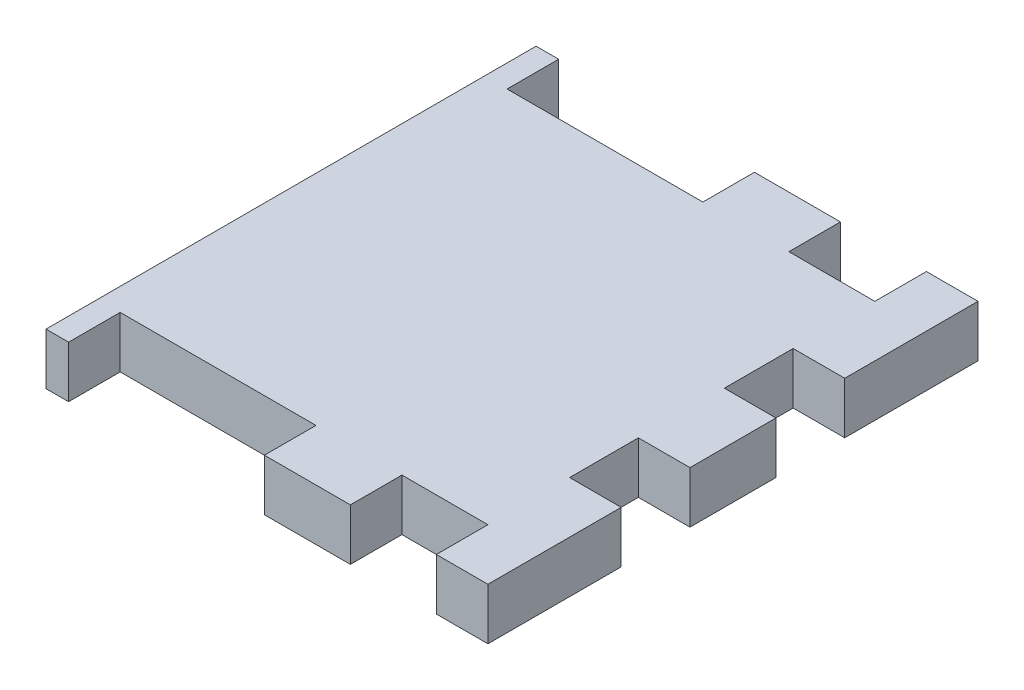
ISO-10303-21;
HEADER;
FILE_DESCRIPTION(('STEP AP214'),'2;1');
FILE_NAME('part.step','',(''),(''),'','','');
FILE_SCHEMA(('AUTOMOTIVE_DESIGN { 1 0 10303 214 1 1 1 1 }'));
ENDSEC;
DATA;
#1=APPLICATION_CONTEXT('core data for automotive mechanical design processes');
#2=APPLICATION_PROTOCOL_DEFINITION('international standard','automotive_design',2000,#1);
#3=PRODUCT_CONTEXT('',#1,'mechanical');
#4=PRODUCT('Part','Part','',(#3));
#5=PRODUCT_RELATED_PRODUCT_CATEGORY('part','',(#4));
#6=PRODUCT_DEFINITION_FORMATION('','',#4);
#7=PRODUCT_DEFINITION_CONTEXT('part definition',#1,'design');
#8=PRODUCT_DEFINITION('design','',#6,#7);
#9=PRODUCT_DEFINITION_SHAPE('','',#8);
#10=(LENGTH_UNIT() NAMED_UNIT(*) SI_UNIT(.MILLI.,.METRE.));
#11=(NAMED_UNIT(*) PLANE_ANGLE_UNIT() SI_UNIT($,.RADIAN.));
#12=(NAMED_UNIT(*) SI_UNIT($,.STERADIAN.) SOLID_ANGLE_UNIT());
#13=UNCERTAINTY_MEASURE_WITH_UNIT(LENGTH_MEASURE(1.E-05),#10,'distance_accuracy_value','');
#14=(GEOMETRIC_REPRESENTATION_CONTEXT(3) GLOBAL_UNCERTAINTY_ASSIGNED_CONTEXT((#13)) GLOBAL_UNIT_ASSIGNED_CONTEXT((#10,
#11,#12)) REPRESENTATION_CONTEXT('',''));
#15=CARTESIAN_POINT('',(0.,0.,0.));
#16=DIRECTION('',(0.,0.,1.));
#17=DIRECTION('',(1.,0.,0.));
#18=AXIS2_PLACEMENT_3D('',#15,#16,#17);
#19=CARTESIAN_POINT('',(12.85,3.,-14.25));
#20=DIRECTION('',(-1.,0.,0.));
#21=DIRECTION('',(0.,0.,1.));
#22=AXIS2_PLACEMENT_3D('',#19,#20,#21);
#23=PLANE('',#22);
#24=DIRECTION('',(0.,0.,-1.));
#25=VECTOR('',#24,1.);
#26=CARTESIAN_POINT('',(12.85,3.,-14.25));
#27=LINE('',#26,#25);
#28=CARTESIAN_POINT('',(12.85,3.,2.50000000000009));
#29=VERTEX_POINT('',#28);
#30=CARTESIAN_POINT('',(12.85,3.,-2.49999999999991));
#31=VERTEX_POINT('',#30);
#32=EDGE_CURVE('E376',#29,#31,#27,.T.);
#33=ORIENTED_EDGE('',*,*,#32,.F.);
#34=DIRECTION('',(0.,-1.,0.));
#35=VECTOR('',#34,1.);
#36=CARTESIAN_POINT('',(12.85,10.,2.50000000000009));
#37=LINE('',#36,#35);
#38=CARTESIAN_POINT('',(12.85,0.,2.50000000000009));
#39=VERTEX_POINT('',#38);
#40=EDGE_CURVE('E247',#29,#39,#37,.T.);
#41=ORIENTED_EDGE('',*,*,#40,.T.);
#42=DIRECTION('',(0.,0.,-1.));
#43=VECTOR('',#42,1.);
#44=CARTESIAN_POINT('',(12.85,0.,-14.25));
#45=LINE('',#44,#43);
#46=CARTESIAN_POINT('',(12.85,0.,-2.4999999999999));
#47=VERTEX_POINT('',#46);
#48=EDGE_CURVE('E394',#39,#47,#45,.T.);
#49=ORIENTED_EDGE('',*,*,#48,.T.);
#50=DIRECTION('',(0.,-1.,0.));
#51=VECTOR('',#50,1.);
#52=CARTESIAN_POINT('',(12.85,10.,-2.49999999999991));
#53=LINE('',#52,#51);
#54=EDGE_CURVE('E276',#31,#47,#53,.T.);
#55=ORIENTED_EDGE('',*,*,#54,.F.);
#56=EDGE_LOOP('',(#33,#41,#49,#55));
#57=FACE_BOUND('',#56,.T.);
#58=ADVANCED_FACE('F34',(#57),#23,.F.);
#59=CARTESIAN_POINT('',(12.85,3.,-6.49999999999989));
#60=VERTEX_POINT('',#59);
#61=CARTESIAN_POINT('',(12.85,3.,-14.25));
#62=VERTEX_POINT('',#61);
#63=EDGE_CURVE('E377',#60,#62,#27,.T.);
#64=ORIENTED_EDGE('',*,*,#63,.F.);
#65=DIRECTION('',(0.,-1.,0.));
#66=VECTOR('',#65,1.);
#67=CARTESIAN_POINT('',(12.85,10.,-6.49999999999989));
#68=LINE('',#67,#66);
#69=CARTESIAN_POINT('',(12.85,0.,-6.49999999999989));
#70=VERTEX_POINT('',#69);
#71=EDGE_CURVE('E258',#60,#70,#68,.T.);
#72=ORIENTED_EDGE('',*,*,#71,.T.);
#73=CARTESIAN_POINT('',(12.85,0.,-14.25));
#74=VERTEX_POINT('',#73);
#75=EDGE_CURVE('E371',#70,#74,#45,.T.);
#76=ORIENTED_EDGE('',*,*,#75,.T.);
#77=DIRECTION('',(0.,-1.,0.));
#78=VECTOR('',#77,1.);
#79=CARTESIAN_POINT('',(12.85,3.,-14.25));
#80=LINE('',#79,#78);
#81=EDGE_CURVE('E11',#62,#74,#80,.T.);
#82=ORIENTED_EDGE('',*,*,#81,.F.);
#83=EDGE_LOOP('',(#64,#72,#76,#82));
#84=FACE_BOUND('',#83,.T.);
#85=ADVANCED_FACE('F460',(#84),#23,.F.);
#86=CARTESIAN_POINT('',(-12.85,3.,-14.25));
#87=DIRECTION('',(0.,0.,1.));
#88=DIRECTION('',(1.,0.,0.));
#89=AXIS2_PLACEMENT_3D('',#86,#87,#88);
#90=PLANE('',#89);
#91=DIRECTION('',(-1.,0.,0.));
#92=VECTOR('',#91,1.);
#93=CARTESIAN_POINT('',(-12.85,3.,-14.25));
#94=LINE('',#93,#92);
#95=CARTESIAN_POINT('',(-11.5362094533038,3.,-14.25));
#96=VERTEX_POINT('',#95);
#97=CARTESIAN_POINT('',(-12.85,3.,-14.25));
#98=VERTEX_POINT('',#97);
#99=EDGE_CURVE('E375',#96,#98,#94,.T.);
#100=ORIENTED_EDGE('',*,*,#99,.F.);
#101=DIRECTION('',(0.,-1.,0.));
#102=VECTOR('',#101,1.);
#103=CARTESIAN_POINT('',(-11.5362094533038,10.,-14.25));
#104=LINE('',#103,#102);
#105=CARTESIAN_POINT('',(-11.5362094533038,0.,-14.25));
#106=VERTEX_POINT('',#105);
#107=EDGE_CURVE('E287',#96,#106,#104,.T.);
#108=ORIENTED_EDGE('',*,*,#107,.T.);
#109=DIRECTION('',(-1.,0.,0.));
#110=VECTOR('',#109,1.);
#111=CARTESIAN_POINT('',(-12.85,0.,-14.25));
#112=LINE('',#111,#110);
#113=CARTESIAN_POINT('',(-12.85,0.,-14.25));
#114=VERTEX_POINT('',#113);
#115=EDGE_CURVE('E393',#106,#114,#112,.T.);
#116=ORIENTED_EDGE('',*,*,#115,.T.);
#117=DIRECTION('',(0.,-1.,0.));
#118=VECTOR('',#117,1.);
#119=CARTESIAN_POINT('',(-12.85,3.,-14.25));
#120=LINE('',#119,#118);
#121=EDGE_CURVE('E42',#98,#114,#120,.T.);
#122=ORIENTED_EDGE('',*,*,#121,.F.);
#123=EDGE_LOOP('',(#100,#108,#116,#122));
#124=FACE_BOUND('',#123,.T.);
#125=ADVANCED_FACE('F437',(#124),#90,.F.);
#126=CARTESIAN_POINT('',(9.85,0.,-14.25));
#127=VERTEX_POINT('',#126);
#128=EDGE_CURVE('E395',#74,#127,#112,.T.);
#129=ORIENTED_EDGE('',*,*,#128,.T.);
#130=DIRECTION('',(0.,-1.,0.));
#131=VECTOR('',#130,1.);
#132=CARTESIAN_POINT('',(9.85,10.,-14.25));
#133=LINE('',#132,#131);
#134=CARTESIAN_POINT('',(9.85,3.,-14.25));
#135=VERTEX_POINT('',#134);
#136=EDGE_CURVE('E328',#135,#127,#133,.T.);
#137=ORIENTED_EDGE('',*,*,#136,.F.);
#138=EDGE_CURVE('E378',#62,#135,#94,.T.);
#139=ORIENTED_EDGE('',*,*,#138,.F.);
#140=ORIENTED_EDGE('',*,*,#81,.T.);
#141=EDGE_LOOP('',(#129,#137,#139,#140));
#142=FACE_BOUND('',#141,.T.);
#143=ADVANCED_FACE('F474',(#142),#90,.F.);
#144=CARTESIAN_POINT('',(-12.85,3.,14.25));
#145=DIRECTION('',(0.,0.,-1.));
#146=DIRECTION('',(-1.,0.,0.));
#147=AXIS2_PLACEMENT_3D('',#144,#145,#146);
#148=PLANE('',#147);
#149=DIRECTION('',(1.,0.,0.));
#150=VECTOR('',#149,1.);
#151=CARTESIAN_POINT('',(-12.85,3.,14.25));
#152=LINE('',#151,#150);
#153=CARTESIAN_POINT('',(9.85,3.,14.2500000000002));
#154=VERTEX_POINT('',#153);
#155=CARTESIAN_POINT('',(12.85,3.,14.25));
#156=VERTEX_POINT('',#155);
#157=EDGE_CURVE('E384',#154,#156,#152,.T.);
#158=ORIENTED_EDGE('',*,*,#157,.F.);
#159=DIRECTION('',(0.,-1.,0.));
#160=VECTOR('',#159,1.);
#161=CARTESIAN_POINT('',(9.85,10.,14.2500000000002));
#162=LINE('',#161,#160);
#163=CARTESIAN_POINT('',(9.85,0.,14.2500000000002));
#164=VERTEX_POINT('',#163);
#165=EDGE_CURVE('E293',#154,#164,#162,.T.);
#166=ORIENTED_EDGE('',*,*,#165,.T.);
#167=DIRECTION('',(1.,0.,0.));
#168=VECTOR('',#167,1.);
#169=CARTESIAN_POINT('',(-12.85,0.,14.25));
#170=LINE('',#169,#168);
#171=CARTESIAN_POINT('',(12.85,0.,14.25));
#172=VERTEX_POINT('',#171);
#173=EDGE_CURVE('E401',#164,#172,#170,.T.);
#174=ORIENTED_EDGE('',*,*,#173,.T.);
#175=DIRECTION('',(0.,-1.,0.));
#176=VECTOR('',#175,1.);
#177=CARTESIAN_POINT('',(12.85,3.,14.25));
#178=LINE('',#177,#176);
#179=EDGE_CURVE('E388',#156,#172,#178,.T.);
#180=ORIENTED_EDGE('',*,*,#179,.F.);
#181=EDGE_LOOP('',(#158,#166,#174,#180));
#182=FACE_BOUND('',#181,.T.);
#183=ADVANCED_FACE('F475',(#182),#148,.F.);
#184=CARTESIAN_POINT('',(-0.150000000000003,0.,14.2500000000002));
#185=VERTEX_POINT('',#184);
#186=CARTESIAN_POINT('',(4.84999999999999,0.,14.25));
#187=VERTEX_POINT('',#186);
#188=EDGE_CURVE('E404',#185,#187,#170,.T.);
#189=ORIENTED_EDGE('',*,*,#188,.T.);
#190=DIRECTION('',(0.,-1.,0.));
#191=VECTOR('',#190,1.);
#192=CARTESIAN_POINT('',(4.85,10.,14.2500000000002));
#193=LINE('',#192,#191);
#194=CARTESIAN_POINT('',(4.85,3.,14.2500000000002));
#195=VERTEX_POINT('',#194);
#196=EDGE_CURVE('E299',#195,#187,#193,.T.);
#197=ORIENTED_EDGE('',*,*,#196,.F.);
#198=CARTESIAN_POINT('',(-0.150000000000003,3.,14.2500000000002));
#199=VERTEX_POINT('',#198);
#200=EDGE_CURVE('E389',#199,#195,#152,.T.);
#201=ORIENTED_EDGE('',*,*,#200,.F.);
#202=DIRECTION('',(0.,-1.,0.));
#203=VECTOR('',#202,1.);
#204=CARTESIAN_POINT('',(-0.150000000000003,10.,14.2500000000002));
#205=LINE('',#204,#203);
#206=EDGE_CURVE('E233',#199,#185,#205,.T.);
#207=ORIENTED_EDGE('',*,*,#206,.T.);
#208=EDGE_LOOP('',(#189,#197,#201,#207));
#209=FACE_BOUND('',#208,.T.);
#210=ADVANCED_FACE('F468',(#209),#148,.F.);
#211=CARTESIAN_POINT('',(12.85,0.,6.50000000000006));
#212=VERTEX_POINT('',#211);
#213=EDGE_CURVE('E390',#172,#212,#45,.T.);
#214=ORIENTED_EDGE('',*,*,#213,.T.);
#215=DIRECTION('',(0.,-1.,0.));
#216=VECTOR('',#215,1.);
#217=CARTESIAN_POINT('',(12.85,10.,6.50000000000007));
#218=LINE('',#217,#216);
#219=CARTESIAN_POINT('',(12.85,3.,6.50000000000007));
#220=VERTEX_POINT('',#219);
#221=EDGE_CURVE('E262',#220,#212,#218,.T.);
#222=ORIENTED_EDGE('',*,*,#221,.F.);
#223=EDGE_CURVE('E372',#156,#220,#27,.T.);
#224=ORIENTED_EDGE('',*,*,#223,.F.);
#225=ORIENTED_EDGE('',*,*,#179,.T.);
#226=EDGE_LOOP('',(#214,#222,#224,#225));
#227=FACE_BOUND('',#226,.T.);
#228=ADVANCED_FACE('F36',(#227),#23,.F.);
#229=CARTESIAN_POINT('',(4.85,0.,-14.25));
#230=VERTEX_POINT('',#229);
#231=CARTESIAN_POINT('',(-0.150000000000003,0.,-14.25));
#232=VERTEX_POINT('',#231);
#233=EDGE_CURVE('E399',#230,#232,#112,.T.);
#234=ORIENTED_EDGE('',*,*,#233,.T.);
#235=DIRECTION('',(0.,-1.,0.));
#236=VECTOR('',#235,1.);
#237=CARTESIAN_POINT('',(-0.149999999999999,10.,-14.2500000000001));
#238=LINE('',#237,#236);
#239=CARTESIAN_POINT('',(-0.149999999999999,3.,-14.2500000000001));
#240=VERTEX_POINT('',#239);
#241=EDGE_CURVE('E57',#240,#232,#238,.T.);
#242=ORIENTED_EDGE('',*,*,#241,.F.);
#243=CARTESIAN_POINT('',(4.85,3.,-14.25));
#244=VERTEX_POINT('',#243);
#245=EDGE_CURVE('E382',#244,#240,#94,.T.);
#246=ORIENTED_EDGE('',*,*,#245,.F.);
#247=DIRECTION('',(0.,-1.,0.));
#248=VECTOR('',#247,1.);
#249=CARTESIAN_POINT('',(4.85,10.,-14.25));
#250=LINE('',#249,#248);
#251=EDGE_CURVE('E331',#244,#230,#250,.T.);
#252=ORIENTED_EDGE('',*,*,#251,.T.);
#253=EDGE_LOOP('',(#234,#242,#246,#252));
#254=FACE_BOUND('',#253,.T.);
#255=ADVANCED_FACE('F434',(#254),#90,.F.);
#256=CARTESIAN_POINT('',(-12.85,3.,-14.25));
#257=DIRECTION('',(1.,0.,0.));
#258=DIRECTION('',(0.,0.,-1.));
#259=AXIS2_PLACEMENT_3D('',#256,#257,#258);
#260=PLANE('',#259);
#261=DIRECTION('',(0.,0.,1.));
#262=VECTOR('',#261,1.);
#263=CARTESIAN_POINT('',(-12.85,0.,-14.25));
#264=LINE('',#263,#262);
#265=CARTESIAN_POINT('',(-12.85,0.,14.25));
#266=VERTEX_POINT('',#265);
#267=EDGE_CURVE('E398',#114,#266,#264,.T.);
#268=ORIENTED_EDGE('',*,*,#267,.T.);
#269=DIRECTION('',(0.,-1.,0.));
#270=VECTOR('',#269,1.);
#271=CARTESIAN_POINT('',(-12.85,3.,14.25));
#272=LINE('',#271,#270);
#273=CARTESIAN_POINT('',(-12.85,3.,14.25));
#274=VERTEX_POINT('',#273);
#275=EDGE_CURVE('E407',#274,#266,#272,.T.);
#276=ORIENTED_EDGE('',*,*,#275,.F.);
#277=DIRECTION('',(0.,0.,1.));
#278=VECTOR('',#277,1.);
#279=CARTESIAN_POINT('',(-12.85,3.,-14.25));
#280=LINE('',#279,#278);
#281=EDGE_CURVE('E381',#98,#274,#280,.T.);
#282=ORIENTED_EDGE('',*,*,#281,.F.);
#283=ORIENTED_EDGE('',*,*,#121,.T.);
#284=EDGE_LOOP('',(#268,#276,#282,#283));
#285=FACE_BOUND('',#284,.T.);
#286=ADVANCED_FACE('F414',(#285),#260,.F.);
#287=CARTESIAN_POINT('',(-11.5362094533038,0.,14.25));
#288=VERTEX_POINT('',#287);
#289=EDGE_CURVE('E402',#266,#288,#170,.T.);
#290=ORIENTED_EDGE('',*,*,#289,.T.);
#291=DIRECTION('',(0.,-1.,0.));
#292=VECTOR('',#291,1.);
#293=CARTESIAN_POINT('',(-11.5362094533038,10.,14.25));
#294=LINE('',#293,#292);
#295=CARTESIAN_POINT('',(-11.5362094533038,3.,14.25));
#296=VERTEX_POINT('',#295);
#297=EDGE_CURVE('E243',#296,#288,#294,.T.);
#298=ORIENTED_EDGE('',*,*,#297,.F.);
#299=EDGE_CURVE('E385',#274,#296,#152,.T.);
#300=ORIENTED_EDGE('',*,*,#299,.F.);
#301=ORIENTED_EDGE('',*,*,#275,.T.);
#302=EDGE_LOOP('',(#290,#298,#300,#301));
#303=FACE_BOUND('',#302,.T.);
#304=ADVANCED_FACE('F421',(#303),#148,.F.);
#305=CARTESIAN_POINT('',(0.,3.,0.));
#306=DIRECTION('',(0.,1.,0.));
#307=DIRECTION('',(0.,0.,1.));
#308=AXIS2_PLACEMENT_3D('',#305,#306,#307);
#309=PLANE('',#308);
#310=DIRECTION('',(0.,0.,-1.));
#311=VECTOR('',#310,1.);
#312=CARTESIAN_POINT('',(-0.149999999999999,3.,0.));
#313=LINE('',#312,#311);
#314=CARTESIAN_POINT('',(-0.149999999999999,3.,-11.2500000000001));
#315=VERTEX_POINT('',#314);
#316=EDGE_CURVE('E359',#315,#240,#313,.T.);
#317=ORIENTED_EDGE('',*,*,#316,.F.);
#318=DIRECTION('',(1.,0.,0.));
#319=VECTOR('',#318,1.);
#320=CARTESIAN_POINT('',(0.,3.,-11.2500000000001));
#321=LINE('',#320,#319);
#322=CARTESIAN_POINT('',(-11.5362094533038,3.,-11.2500000000001));
#323=VERTEX_POINT('',#322);
#324=EDGE_CURVE('E367',#323,#315,#321,.T.);
#325=ORIENTED_EDGE('',*,*,#324,.F.);
#326=DIRECTION('',(0.,0.,1.));
#327=VECTOR('',#326,1.);
#328=CARTESIAN_POINT('',(-11.5362094533038,3.,0.));
#329=LINE('',#328,#327);
#330=EDGE_CURVE('E369',#96,#323,#329,.T.);
#331=ORIENTED_EDGE('',*,*,#330,.F.);
#332=ORIENTED_EDGE('',*,*,#99,.T.);
#333=ORIENTED_EDGE('',*,*,#281,.T.);
#334=ORIENTED_EDGE('',*,*,#299,.T.);
#335=DIRECTION('',(0.,0.,1.));
#336=VECTOR('',#335,1.);
#337=CARTESIAN_POINT('',(-11.5362094533038,3.,0.));
#338=LINE('',#337,#336);
#339=CARTESIAN_POINT('',(-11.5362094533038,3.,11.2500000000001));
#340=VERTEX_POINT('',#339);
#341=EDGE_CURVE('E354',#340,#296,#338,.T.);
#342=ORIENTED_EDGE('',*,*,#341,.F.);
#343=DIRECTION('',(-1.,0.,0.));
#344=VECTOR('',#343,1.);
#345=CARTESIAN_POINT('',(0.,3.,11.2500000000002));
#346=LINE('',#345,#344);
#347=CARTESIAN_POINT('',(-0.150000000000002,3.,11.2500000000002));
#348=VERTEX_POINT('',#347);
#349=EDGE_CURVE('E239',#348,#340,#346,.T.);
#350=ORIENTED_EDGE('',*,*,#349,.F.);
#351=DIRECTION('',(0.,0.,-1.));
#352=VECTOR('',#351,1.);
#353=CARTESIAN_POINT('',(-0.149999999999998,3.,0.));
#354=LINE('',#353,#352);
#355=EDGE_CURVE('E357',#199,#348,#354,.T.);
#356=ORIENTED_EDGE('',*,*,#355,.F.);
#357=ORIENTED_EDGE('',*,*,#200,.T.);
#358=DIRECTION('',(0.,0.,1.));
#359=VECTOR('',#358,1.);
#360=CARTESIAN_POINT('',(4.85,3.,0.));
#361=LINE('',#360,#359);
#362=CARTESIAN_POINT('',(4.85,3.,11.2500000000002));
#363=VERTEX_POINT('',#362);
#364=EDGE_CURVE('E361',#363,#195,#361,.T.);
#365=ORIENTED_EDGE('',*,*,#364,.F.);
#366=DIRECTION('',(-1.,0.,0.));
#367=VECTOR('',#366,1.);
#368=CARTESIAN_POINT('',(0.,3.,11.2500000000002));
#369=LINE('',#368,#367);
#370=CARTESIAN_POINT('',(9.85,3.,11.2500000000002));
#371=VERTEX_POINT('',#370);
#372=EDGE_CURVE('E363',#371,#363,#369,.T.);
#373=ORIENTED_EDGE('',*,*,#372,.F.);
#374=DIRECTION('',(0.,0.,-1.));
#375=VECTOR('',#374,1.);
#376=CARTESIAN_POINT('',(9.85,3.,0.));
#377=LINE('',#376,#375);
#378=EDGE_CURVE('E365',#154,#371,#377,.T.);
#379=ORIENTED_EDGE('',*,*,#378,.F.);
#380=ORIENTED_EDGE('',*,*,#157,.T.);
#381=ORIENTED_EDGE('',*,*,#223,.T.);
#382=DIRECTION('',(1.,0.,0.));
#383=VECTOR('',#382,1.);
#384=CARTESIAN_POINT('',(0.,3.,6.50000000000007));
#385=LINE('',#384,#383);
#386=CARTESIAN_POINT('',(9.85,3.,6.50000000000007));
#387=VERTEX_POINT('',#386);
#388=EDGE_CURVE('E348',#387,#220,#385,.T.);
#389=ORIENTED_EDGE('',*,*,#388,.F.);
#390=DIRECTION('',(0.,0.,1.));
#391=VECTOR('',#390,1.);
#392=CARTESIAN_POINT('',(9.85,3.,0.));
#393=LINE('',#392,#391);
#394=CARTESIAN_POINT('',(9.85,3.,2.50000000000007));
#395=VERTEX_POINT('',#394);
#396=EDGE_CURVE('E350',#395,#387,#393,.T.);
#397=ORIENTED_EDGE('',*,*,#396,.F.);
#398=DIRECTION('',(-1.,0.,0.));
#399=VECTOR('',#398,1.);
#400=CARTESIAN_POINT('',(0.,3.,2.5));
#401=LINE('',#400,#399);
#402=EDGE_CURVE('E352',#29,#395,#401,.T.);
#403=ORIENTED_EDGE('',*,*,#402,.F.);
#404=ORIENTED_EDGE('',*,*,#32,.T.);
#405=DIRECTION('',(1.,0.,0.));
#406=VECTOR('',#405,1.);
#407=CARTESIAN_POINT('',(0.,3.,-2.49999999999983));
#408=LINE('',#407,#406);
#409=CARTESIAN_POINT('',(9.85,3.,-2.49999999999989));
#410=VERTEX_POINT('',#409);
#411=EDGE_CURVE('E342',#410,#31,#408,.T.);
#412=ORIENTED_EDGE('',*,*,#411,.F.);
#413=DIRECTION('',(0.,0.,1.));
#414=VECTOR('',#413,1.);
#415=CARTESIAN_POINT('',(9.85,3.,0.));
#416=LINE('',#415,#414);
#417=CARTESIAN_POINT('',(9.85,3.,-6.49999999999989));
#418=VERTEX_POINT('',#417);
#419=EDGE_CURVE('E344',#418,#410,#416,.T.);
#420=ORIENTED_EDGE('',*,*,#419,.F.);
#421=DIRECTION('',(-1.,0.,0.));
#422=VECTOR('',#421,1.);
#423=CARTESIAN_POINT('',(0.,3.,-6.49999999999989));
#424=LINE('',#423,#422);
#425=EDGE_CURVE('E346',#60,#418,#424,.T.);
#426=ORIENTED_EDGE('',*,*,#425,.F.);
#427=ORIENTED_EDGE('',*,*,#63,.T.);
#428=ORIENTED_EDGE('',*,*,#138,.T.);
#429=DIRECTION('',(0.,0.,-1.));
#430=VECTOR('',#429,1.);
#431=CARTESIAN_POINT('',(9.85,3.,0.));
#432=LINE('',#431,#430);
#433=CARTESIAN_POINT('',(9.85,3.,-11.25));
#434=VERTEX_POINT('',#433);
#435=EDGE_CURVE('E340',#434,#135,#432,.T.);
#436=ORIENTED_EDGE('',*,*,#435,.F.);
#437=DIRECTION('',(1.,0.,0.));
#438=VECTOR('',#437,1.);
#439=CARTESIAN_POINT('',(0.,3.,-11.25));
#440=LINE('',#439,#438);
#441=CARTESIAN_POINT('',(4.85,3.,-11.25));
#442=VERTEX_POINT('',#441);
#443=EDGE_CURVE('E330',#442,#434,#440,.T.);
#444=ORIENTED_EDGE('',*,*,#443,.F.);
#445=DIRECTION('',(0.,0.,1.));
#446=VECTOR('',#445,1.);
#447=CARTESIAN_POINT('',(4.85,3.,0.));
#448=LINE('',#447,#446);
#449=EDGE_CURVE('E338',#244,#442,#448,.T.);
#450=ORIENTED_EDGE('',*,*,#449,.F.);
#451=ORIENTED_EDGE('',*,*,#245,.T.);
#452=EDGE_LOOP('',(#317,#325,#331,#332,#333,#334,#342,#350,#356,#357,#365,#373,#379,#380,#381,
#389,#397,#403,#404,#412,#420,#426,#427,#428,#436,#444,#450,#451));
#453=FACE_BOUND('',#452,.T.);
#454=ADVANCED_FACE('F425',(#453),#309,.T.);
#455=CARTESIAN_POINT('',(0.,0.,0.));
#456=DIRECTION('',(0.,1.,0.));
#457=DIRECTION('',(0.,0.,1.));
#458=AXIS2_PLACEMENT_3D('',#455,#456,#457);
#459=PLANE('',#458);
#460=DIRECTION('',(-1.,0.,0.));
#461=VECTOR('',#460,1.);
#462=CARTESIAN_POINT('',(-9.5362094533038,0.,-11.2500000000001));
#463=LINE('',#462,#461);
#464=CARTESIAN_POINT('',(-0.149999999999999,0.,-11.2500000000001));
#465=VERTEX_POINT('',#464);
#466=CARTESIAN_POINT('',(-11.5362094533038,0.,-11.2500000000001));
#467=VERTEX_POINT('',#466);
#468=EDGE_CURVE('E242',#465,#467,#463,.T.);
#469=ORIENTED_EDGE('',*,*,#468,.F.);
#470=DIRECTION('',(0.,0.,1.));
#471=VECTOR('',#470,1.);
#472=CARTESIAN_POINT('',(-0.149999999999999,0.,-14.2500000000001));
#473=LINE('',#472,#471);
#474=EDGE_CURVE('E296',#232,#465,#473,.T.);
#475=ORIENTED_EDGE('',*,*,#474,.F.);
#476=ORIENTED_EDGE('',*,*,#233,.F.);
#477=DIRECTION('',(0.,0.,-1.));
#478=VECTOR('',#477,1.);
#479=CARTESIAN_POINT('',(4.85,0.,-14.25));
#480=LINE('',#479,#478);
#481=CARTESIAN_POINT('',(4.85,0.,-11.25));
#482=VERTEX_POINT('',#481);
#483=EDGE_CURVE('E325',#482,#230,#480,.T.);
#484=ORIENTED_EDGE('',*,*,#483,.F.);
#485=DIRECTION('',(-1.,0.,0.));
#486=VECTOR('',#485,1.);
#487=CARTESIAN_POINT('',(9.85,0.,-11.25));
#488=LINE('',#487,#486);
#489=CARTESIAN_POINT('',(9.85,0.,-11.25));
#490=VERTEX_POINT('',#489);
#491=EDGE_CURVE('E322',#490,#482,#488,.T.);
#492=ORIENTED_EDGE('',*,*,#491,.F.);
#493=DIRECTION('',(0.,0.,1.));
#494=VECTOR('',#493,1.);
#495=CARTESIAN_POINT('',(9.85,0.,-14.25));
#496=LINE('',#495,#494);
#497=EDGE_CURVE('E49',#127,#490,#496,.T.);
#498=ORIENTED_EDGE('',*,*,#497,.F.);
#499=ORIENTED_EDGE('',*,*,#128,.F.);
#500=ORIENTED_EDGE('',*,*,#75,.F.);
#501=DIRECTION('',(1.,0.,0.));
#502=VECTOR('',#501,1.);
#503=CARTESIAN_POINT('',(12.85,0.,-6.49999999999989));
#504=LINE('',#503,#502);
#505=CARTESIAN_POINT('',(9.85,0.,-6.49999999999989));
#506=VERTEX_POINT('',#505);
#507=EDGE_CURVE('E274',#506,#70,#504,.T.);
#508=ORIENTED_EDGE('',*,*,#507,.F.);
#509=DIRECTION('',(0.,0.,-1.));
#510=VECTOR('',#509,1.);
#511=CARTESIAN_POINT('',(9.85,0.,-6.49999999999989));
#512=LINE('',#511,#510);
#513=CARTESIAN_POINT('',(9.85,0.,-2.49999999999989));
#514=VERTEX_POINT('',#513);
#515=EDGE_CURVE('E271',#514,#506,#512,.T.);
#516=ORIENTED_EDGE('',*,*,#515,.F.);
#517=DIRECTION('',(-1.,0.,0.));
#518=VECTOR('',#517,1.);
#519=CARTESIAN_POINT('',(12.85,0.,-2.49999999999991));
#520=LINE('',#519,#518);
#521=EDGE_CURVE('E268',#47,#514,#520,.T.);
#522=ORIENTED_EDGE('',*,*,#521,.F.);
#523=ORIENTED_EDGE('',*,*,#48,.F.);
#524=DIRECTION('',(1.,0.,0.));
#525=VECTOR('',#524,1.);
#526=CARTESIAN_POINT('',(12.85,0.,2.50000000000009));
#527=LINE('',#526,#525);
#528=CARTESIAN_POINT('',(9.85,0.,2.50000000000007));
#529=VERTEX_POINT('',#528);
#530=EDGE_CURVE('E261',#529,#39,#527,.T.);
#531=ORIENTED_EDGE('',*,*,#530,.F.);
#532=DIRECTION('',(0.,0.,-1.));
#533=VECTOR('',#532,1.);
#534=CARTESIAN_POINT('',(9.85,0.,6.50000000000007));
#535=LINE('',#534,#533);
#536=CARTESIAN_POINT('',(9.85,0.,6.50000000000007));
#537=VERTEX_POINT('',#536);
#538=EDGE_CURVE('E257',#537,#529,#535,.T.);
#539=ORIENTED_EDGE('',*,*,#538,.F.);
#540=DIRECTION('',(-1.,0.,0.));
#541=VECTOR('',#540,1.);
#542=CARTESIAN_POINT('',(12.85,0.,6.50000000000007));
#543=LINE('',#542,#541);
#544=EDGE_CURVE('E254',#212,#537,#543,.T.);
#545=ORIENTED_EDGE('',*,*,#544,.F.);
#546=ORIENTED_EDGE('',*,*,#213,.F.);
#547=ORIENTED_EDGE('',*,*,#173,.F.);
#548=DIRECTION('',(0.,0.,1.));
#549=VECTOR('',#548,1.);
#550=CARTESIAN_POINT('',(9.85,0.,14.2500000000002));
#551=LINE('',#550,#549);
#552=CARTESIAN_POINT('',(9.85,0.,11.2500000000002));
#553=VERTEX_POINT('',#552);
#554=EDGE_CURVE('E284',#553,#164,#551,.T.);
#555=ORIENTED_EDGE('',*,*,#554,.F.);
#556=DIRECTION('',(1.,0.,0.));
#557=VECTOR('',#556,1.);
#558=CARTESIAN_POINT('',(9.85,0.,11.2500000000002));
#559=LINE('',#558,#557);
#560=CARTESIAN_POINT('',(4.85,0.,11.2500000000002));
#561=VERTEX_POINT('',#560);
#562=EDGE_CURVE('E290',#561,#553,#559,.T.);
#563=ORIENTED_EDGE('',*,*,#562,.F.);
#564=DIRECTION('',(0.,0.,-1.));
#565=VECTOR('',#564,1.);
#566=CARTESIAN_POINT('',(4.85,0.,14.2500000000002));
#567=LINE('',#566,#565);
#568=EDGE_CURVE('E286',#187,#561,#567,.T.);
#569=ORIENTED_EDGE('',*,*,#568,.F.);
#570=ORIENTED_EDGE('',*,*,#188,.F.);
#571=DIRECTION('',(0.,0.,1.));
#572=VECTOR('',#571,1.);
#573=CARTESIAN_POINT('',(-0.150000000000003,0.,14.2500000000002));
#574=LINE('',#573,#572);
#575=CARTESIAN_POINT('',(-0.150000000000002,0.,11.2500000000002));
#576=VERTEX_POINT('',#575);
#577=EDGE_CURVE('E229',#576,#185,#574,.T.);
#578=ORIENTED_EDGE('',*,*,#577,.F.);
#579=DIRECTION('',(1.,0.,0.));
#580=VECTOR('',#579,1.);
#581=CARTESIAN_POINT('',(-0.150000000000002,0.,11.2500000000002));
#582=LINE('',#581,#580);
#583=CARTESIAN_POINT('',(-11.5362094533038,0.,11.2500000000001));
#584=VERTEX_POINT('',#583);
#585=EDGE_CURVE('E221',#584,#576,#582,.T.);
#586=ORIENTED_EDGE('',*,*,#585,.F.);
#587=DIRECTION('',(0.,0.,-1.));
#588=VECTOR('',#587,1.);
#589=CARTESIAN_POINT('',(-11.5362094533038,0.,14.25));
#590=LINE('',#589,#588);
#591=EDGE_CURVE('E226',#288,#584,#590,.T.);
#592=ORIENTED_EDGE('',*,*,#591,.F.);
#593=ORIENTED_EDGE('',*,*,#289,.F.);
#594=ORIENTED_EDGE('',*,*,#267,.F.);
#595=ORIENTED_EDGE('',*,*,#115,.F.);
#596=DIRECTION('',(0.,0.,-1.));
#597=VECTOR('',#596,1.);
#598=CARTESIAN_POINT('',(-11.5362094533038,0.,-14.25));
#599=LINE('',#598,#597);
#600=EDGE_CURVE('E304',#467,#106,#599,.T.);
#601=ORIENTED_EDGE('',*,*,#600,.F.);
#602=EDGE_LOOP('',(#469,#475,#476,#484,#492,#498,#499,#500,#508,#516,#522,#523,#531,#539,#545,
#546,#547,#555,#563,#569,#570,#578,#586,#592,#593,#594,#595,#601));
#603=FACE_BOUND('',#602,.T.);
#604=ADVANCED_FACE('F223',(#603),#459,.F.);
#605=CARTESIAN_POINT('',(9.85,10.,-14.25));
#606=DIRECTION('',(1.,0.,0.));
#607=DIRECTION('',(0.,0.,-1.));
#608=AXIS2_PLACEMENT_3D('',#605,#606,#607);
#609=PLANE('',#608);
#610=ORIENTED_EDGE('',*,*,#435,.T.);
#611=ORIENTED_EDGE('',*,*,#136,.T.);
#612=ORIENTED_EDGE('',*,*,#497,.T.);
#613=DIRECTION('',(0.,-1.,0.));
#614=VECTOR('',#613,1.);
#615=CARTESIAN_POINT('',(9.85,10.,-11.25));
#616=LINE('',#615,#614);
#617=EDGE_CURVE('E327',#434,#490,#616,.T.);
#618=ORIENTED_EDGE('',*,*,#617,.F.);
#619=EDGE_LOOP('',(#610,#611,#612,#618));
#620=FACE_BOUND('',#619,.T.);
#621=ADVANCED_FACE('F569',(#620),#609,.F.);
#622=CARTESIAN_POINT('',(4.85,10.,-14.25));
#623=DIRECTION('',(-1.,0.,0.));
#624=DIRECTION('',(0.,0.,1.));
#625=AXIS2_PLACEMENT_3D('',#622,#623,#624);
#626=PLANE('',#625);
#627=ORIENTED_EDGE('',*,*,#449,.T.);
#628=DIRECTION('',(0.,-1.,0.));
#629=VECTOR('',#628,1.);
#630=CARTESIAN_POINT('',(4.85,10.,-11.25));
#631=LINE('',#630,#629);
#632=EDGE_CURVE('E334',#442,#482,#631,.T.);
#633=ORIENTED_EDGE('',*,*,#632,.T.);
#634=ORIENTED_EDGE('',*,*,#483,.T.);
#635=ORIENTED_EDGE('',*,*,#251,.F.);
#636=EDGE_LOOP('',(#627,#633,#634,#635));
#637=FACE_BOUND('',#636,.T.);
#638=ADVANCED_FACE('F571',(#637),#626,.F.);
#639=CARTESIAN_POINT('',(9.85,10.,-11.25));
#640=DIRECTION('',(0.,0.,1.));
#641=DIRECTION('',(1.,0.,0.));
#642=AXIS2_PLACEMENT_3D('',#639,#640,#641);
#643=PLANE('',#642);
#644=ORIENTED_EDGE('',*,*,#443,.T.);
#645=ORIENTED_EDGE('',*,*,#617,.T.);
#646=ORIENTED_EDGE('',*,*,#491,.T.);
#647=ORIENTED_EDGE('',*,*,#632,.F.);
#648=EDGE_LOOP('',(#644,#645,#646,#647));
#649=FACE_BOUND('',#648,.T.);
#650=ADVANCED_FACE('F536',(#649),#643,.F.);
#651=CARTESIAN_POINT('',(12.85,10.,-6.49999999999989));
#652=DIRECTION('',(0.,0.,-1.));
#653=DIRECTION('',(-1.,0.,0.));
#654=AXIS2_PLACEMENT_3D('',#651,#652,#653);
#655=PLANE('',#654);
#656=ORIENTED_EDGE('',*,*,#425,.T.);
#657=DIRECTION('',(0.,-1.,0.));
#658=VECTOR('',#657,1.);
#659=CARTESIAN_POINT('',(9.85,10.,-6.49999999999989));
#660=LINE('',#659,#658);
#661=EDGE_CURVE('E279',#418,#506,#660,.T.);
#662=ORIENTED_EDGE('',*,*,#661,.T.);
#663=ORIENTED_EDGE('',*,*,#507,.T.);
#664=ORIENTED_EDGE('',*,*,#71,.F.);
#665=EDGE_LOOP('',(#656,#662,#663,#664));
#666=FACE_BOUND('',#665,.T.);
#667=ADVANCED_FACE('F532',(#666),#655,.F.);
#668=CARTESIAN_POINT('',(9.85,10.,-6.49999999999989));
#669=DIRECTION('',(-1.,0.,0.));
#670=DIRECTION('',(0.,0.,1.));
#671=AXIS2_PLACEMENT_3D('',#668,#669,#670);
#672=PLANE('',#671);
#673=ORIENTED_EDGE('',*,*,#419,.T.);
#674=DIRECTION('',(0.,-1.,0.));
#675=VECTOR('',#674,1.);
#676=CARTESIAN_POINT('',(9.85,10.,-2.49999999999989));
#677=LINE('',#676,#675);
#678=EDGE_CURVE('E281',#410,#514,#677,.T.);
#679=ORIENTED_EDGE('',*,*,#678,.T.);
#680=ORIENTED_EDGE('',*,*,#515,.T.);
#681=ORIENTED_EDGE('',*,*,#661,.F.);
#682=EDGE_LOOP('',(#673,#679,#680,#681));
#683=FACE_BOUND('',#682,.T.);
#684=ADVANCED_FACE('F528',(#683),#672,.F.);
#685=CARTESIAN_POINT('',(12.85,10.,-2.49999999999991));
#686=DIRECTION('',(0.,0.,1.));
#687=DIRECTION('',(1.,0.,0.));
#688=AXIS2_PLACEMENT_3D('',#685,#686,#687);
#689=PLANE('',#688);
#690=ORIENTED_EDGE('',*,*,#411,.T.);
#691=ORIENTED_EDGE('',*,*,#54,.T.);
#692=ORIENTED_EDGE('',*,*,#521,.T.);
#693=ORIENTED_EDGE('',*,*,#678,.F.);
#694=EDGE_LOOP('',(#690,#691,#692,#693));
#695=FACE_BOUND('',#694,.T.);
#696=ADVANCED_FACE('F524',(#695),#689,.F.);
#697=CARTESIAN_POINT('',(12.85,10.,2.50000000000009));
#698=DIRECTION('',(0.,0.,-1.));
#699=DIRECTION('',(-1.,0.,0.));
#700=AXIS2_PLACEMENT_3D('',#697,#698,#699);
#701=PLANE('',#700);
#702=ORIENTED_EDGE('',*,*,#402,.T.);
#703=DIRECTION('',(0.,-1.,0.));
#704=VECTOR('',#703,1.);
#705=CARTESIAN_POINT('',(9.85,10.,2.50000000000007));
#706=LINE('',#705,#704);
#707=EDGE_CURVE('E251',#395,#529,#706,.T.);
#708=ORIENTED_EDGE('',*,*,#707,.T.);
#709=ORIENTED_EDGE('',*,*,#530,.T.);
#710=ORIENTED_EDGE('',*,*,#40,.F.);
#711=EDGE_LOOP('',(#702,#708,#709,#710));
#712=FACE_BOUND('',#711,.T.);
#713=ADVANCED_FACE('F527',(#712),#701,.F.);
#714=CARTESIAN_POINT('',(9.85,10.,6.50000000000007));
#715=DIRECTION('',(-1.,0.,0.));
#716=DIRECTION('',(0.,0.,1.));
#717=AXIS2_PLACEMENT_3D('',#714,#715,#716);
#718=PLANE('',#717);
#719=ORIENTED_EDGE('',*,*,#396,.T.);
#720=DIRECTION('',(0.,-1.,0.));
#721=VECTOR('',#720,1.);
#722=CARTESIAN_POINT('',(9.85,10.,6.50000000000007));
#723=LINE('',#722,#721);
#724=EDGE_CURVE('E265',#387,#537,#723,.T.);
#725=ORIENTED_EDGE('',*,*,#724,.T.);
#726=ORIENTED_EDGE('',*,*,#538,.T.);
#727=ORIENTED_EDGE('',*,*,#707,.F.);
#728=EDGE_LOOP('',(#719,#725,#726,#727));
#729=FACE_BOUND('',#728,.T.);
#730=ADVANCED_FACE('F540',(#729),#718,.F.);
#731=CARTESIAN_POINT('',(12.85,10.,6.50000000000007));
#732=DIRECTION('',(0.,0.,1.));
#733=DIRECTION('',(1.,0.,0.));
#734=AXIS2_PLACEMENT_3D('',#731,#732,#733);
#735=PLANE('',#734);
#736=ORIENTED_EDGE('',*,*,#388,.T.);
#737=ORIENTED_EDGE('',*,*,#221,.T.);
#738=ORIENTED_EDGE('',*,*,#544,.T.);
#739=ORIENTED_EDGE('',*,*,#724,.F.);
#740=EDGE_LOOP('',(#736,#737,#738,#739));
#741=FACE_BOUND('',#740,.T.);
#742=ADVANCED_FACE('F489',(#741),#735,.F.);
#743=CARTESIAN_POINT('',(-11.5362094533038,10.,14.25));
#744=DIRECTION('',(-1.,0.,0.));
#745=DIRECTION('',(0.,0.,1.));
#746=AXIS2_PLACEMENT_3D('',#743,#744,#745);
#747=PLANE('',#746);
#748=ORIENTED_EDGE('',*,*,#341,.T.);
#749=ORIENTED_EDGE('',*,*,#297,.T.);
#750=ORIENTED_EDGE('',*,*,#591,.T.);
#751=DIRECTION('',(0.,-1.,0.));
#752=VECTOR('',#751,1.);
#753=CARTESIAN_POINT('',(-11.5362094533038,10.,11.2500000000001));
#754=LINE('',#753,#752);
#755=EDGE_CURVE('E236',#340,#584,#754,.T.);
#756=ORIENTED_EDGE('',*,*,#755,.F.);
#757=EDGE_LOOP('',(#748,#749,#750,#756));
#758=FACE_BOUND('',#757,.T.);
#759=ADVANCED_FACE('F245',(#758),#747,.F.);
#760=CARTESIAN_POINT('',(-0.150000000000003,10.,14.2500000000002));
#761=DIRECTION('',(1.,0.,0.));
#762=DIRECTION('',(0.,0.,-1.));
#763=AXIS2_PLACEMENT_3D('',#760,#761,#762);
#764=PLANE('',#763);
#765=ORIENTED_EDGE('',*,*,#355,.T.);
#766=DIRECTION('',(0.,-1.,0.));
#767=VECTOR('',#766,1.);
#768=CARTESIAN_POINT('',(-0.150000000000002,10.,11.2500000000002));
#769=LINE('',#768,#767);
#770=EDGE_CURVE('E313',#348,#576,#769,.T.);
#771=ORIENTED_EDGE('',*,*,#770,.T.);
#772=ORIENTED_EDGE('',*,*,#577,.T.);
#773=ORIENTED_EDGE('',*,*,#206,.F.);
#774=EDGE_LOOP('',(#765,#771,#772,#773));
#775=FACE_BOUND('',#774,.T.);
#776=ADVANCED_FACE('F455',(#775),#764,.F.);
#777=CARTESIAN_POINT('',(-0.150000000000002,10.,11.2500000000002));
#778=DIRECTION('',(0.,0.,-1.));
#779=DIRECTION('',(-1.,0.,0.));
#780=AXIS2_PLACEMENT_3D('',#777,#778,#779);
#781=PLANE('',#780);
#782=ORIENTED_EDGE('',*,*,#349,.T.);
#783=ORIENTED_EDGE('',*,*,#755,.T.);
#784=ORIENTED_EDGE('',*,*,#585,.T.);
#785=ORIENTED_EDGE('',*,*,#770,.F.);
#786=EDGE_LOOP('',(#782,#783,#784,#785));
#787=FACE_BOUND('',#786,.T.);
#788=ADVANCED_FACE('F237',(#787),#781,.F.);
#789=CARTESIAN_POINT('',(-0.149999999999999,10.,-14.2500000000001));
#790=DIRECTION('',(1.,0.,0.));
#791=DIRECTION('',(0.,0.,-1.));
#792=AXIS2_PLACEMENT_3D('',#789,#790,#791);
#793=PLANE('',#792);
#794=ORIENTED_EDGE('',*,*,#316,.T.);
#795=ORIENTED_EDGE('',*,*,#241,.T.);
#796=ORIENTED_EDGE('',*,*,#474,.T.);
#797=DIRECTION('',(0.,-1.,0.));
#798=VECTOR('',#797,1.);
#799=CARTESIAN_POINT('',(-0.149999999999999,10.,-11.2500000000001));
#800=LINE('',#799,#798);
#801=EDGE_CURVE('E311',#315,#465,#800,.T.);
#802=ORIENTED_EDGE('',*,*,#801,.F.);
#803=EDGE_LOOP('',(#794,#795,#796,#802));
#804=FACE_BOUND('',#803,.T.);
#805=ADVANCED_FACE('F444',(#804),#793,.F.);
#806=CARTESIAN_POINT('',(9.85,10.,14.2500000000002));
#807=DIRECTION('',(1.,0.,0.));
#808=DIRECTION('',(0.,0.,-1.));
#809=AXIS2_PLACEMENT_3D('',#806,#807,#808);
#810=PLANE('',#809);
#811=ORIENTED_EDGE('',*,*,#378,.T.);
#812=DIRECTION('',(0.,-1.,0.));
#813=VECTOR('',#812,1.);
#814=CARTESIAN_POINT('',(9.85,10.,11.2500000000002));
#815=LINE('',#814,#813);
#816=EDGE_CURVE('E294',#371,#553,#815,.T.);
#817=ORIENTED_EDGE('',*,*,#816,.T.);
#818=ORIENTED_EDGE('',*,*,#554,.T.);
#819=ORIENTED_EDGE('',*,*,#165,.F.);
#820=EDGE_LOOP('',(#811,#817,#818,#819));
#821=FACE_BOUND('',#820,.T.);
#822=ADVANCED_FACE('F446',(#821),#810,.F.);
#823=CARTESIAN_POINT('',(9.85,10.,11.2500000000002));
#824=DIRECTION('',(0.,0.,-1.));
#825=DIRECTION('',(-1.,0.,0.));
#826=AXIS2_PLACEMENT_3D('',#823,#824,#825);
#827=PLANE('',#826);
#828=ORIENTED_EDGE('',*,*,#372,.T.);
#829=DIRECTION('',(0.,-1.,0.));
#830=VECTOR('',#829,1.);
#831=CARTESIAN_POINT('',(4.85,10.,11.2500000000002));
#832=LINE('',#831,#830);
#833=EDGE_CURVE('E297',#363,#561,#832,.T.);
#834=ORIENTED_EDGE('',*,*,#833,.T.);
#835=ORIENTED_EDGE('',*,*,#562,.T.);
#836=ORIENTED_EDGE('',*,*,#816,.F.);
#837=EDGE_LOOP('',(#828,#834,#835,#836));
#838=FACE_BOUND('',#837,.T.);
#839=ADVANCED_FACE('F452',(#838),#827,.F.);
#840=CARTESIAN_POINT('',(4.85,10.,14.2500000000002));
#841=DIRECTION('',(-1.,0.,0.));
#842=DIRECTION('',(0.,0.,1.));
#843=AXIS2_PLACEMENT_3D('',#840,#841,#842);
#844=PLANE('',#843);
#845=ORIENTED_EDGE('',*,*,#364,.T.);
#846=ORIENTED_EDGE('',*,*,#196,.T.);
#847=ORIENTED_EDGE('',*,*,#568,.T.);
#848=ORIENTED_EDGE('',*,*,#833,.F.);
#849=EDGE_LOOP('',(#845,#846,#847,#848));
#850=FACE_BOUND('',#849,.T.);
#851=ADVANCED_FACE('F505',(#850),#844,.F.);
#852=CARTESIAN_POINT('',(-11.5362094533038,10.,-14.25));
#853=DIRECTION('',(-1.,0.,0.));
#854=DIRECTION('',(0.,0.,1.));
#855=AXIS2_PLACEMENT_3D('',#852,#853,#854);
#856=PLANE('',#855);
#857=ORIENTED_EDGE('',*,*,#330,.T.);
#858=DIRECTION('',(0.,-1.,0.));
#859=VECTOR('',#858,1.);
#860=CARTESIAN_POINT('',(-11.5362094533038,10.,-11.2500000000001));
#861=LINE('',#860,#859);
#862=EDGE_CURVE('E306',#323,#467,#861,.T.);
#863=ORIENTED_EDGE('',*,*,#862,.T.);
#864=ORIENTED_EDGE('',*,*,#600,.T.);
#865=ORIENTED_EDGE('',*,*,#107,.F.);
#866=EDGE_LOOP('',(#857,#863,#864,#865));
#867=FACE_BOUND('',#866,.T.);
#868=ADVANCED_FACE('F439',(#867),#856,.F.);
#869=CARTESIAN_POINT('',(-9.5362094533038,10.,-11.2500000000001));
#870=DIRECTION('',(0.,0.,1.));
#871=DIRECTION('',(1.,0.,0.));
#872=AXIS2_PLACEMENT_3D('',#869,#870,#871);
#873=PLANE('',#872);
#874=ORIENTED_EDGE('',*,*,#324,.T.);
#875=ORIENTED_EDGE('',*,*,#801,.T.);
#876=ORIENTED_EDGE('',*,*,#468,.T.);
#877=ORIENTED_EDGE('',*,*,#862,.F.);
#878=EDGE_LOOP('',(#874,#875,#876,#877));
#879=FACE_BOUND('',#878,.T.);
#880=ADVANCED_FACE('F443',(#879),#873,.F.);
#881=CLOSED_SHELL('',(#58,#85,#125,#143,#183,#210,#228,#255,#286,#304,#454,#604,#621,#638,#650,
#667,#684,#696,#713,#730,#742,#759,#776,#788,#805,#822,#839,#851,#868,#880));
#882=MANIFOLD_SOLID_BREP('B2',#881);
#883=ADVANCED_BREP_SHAPE_REPRESENTATION('',(#18,#882),#14);
#884=SHAPE_DEFINITION_REPRESENTATION(#9,#883);
ENDSEC;
END-ISO-10303-21;
